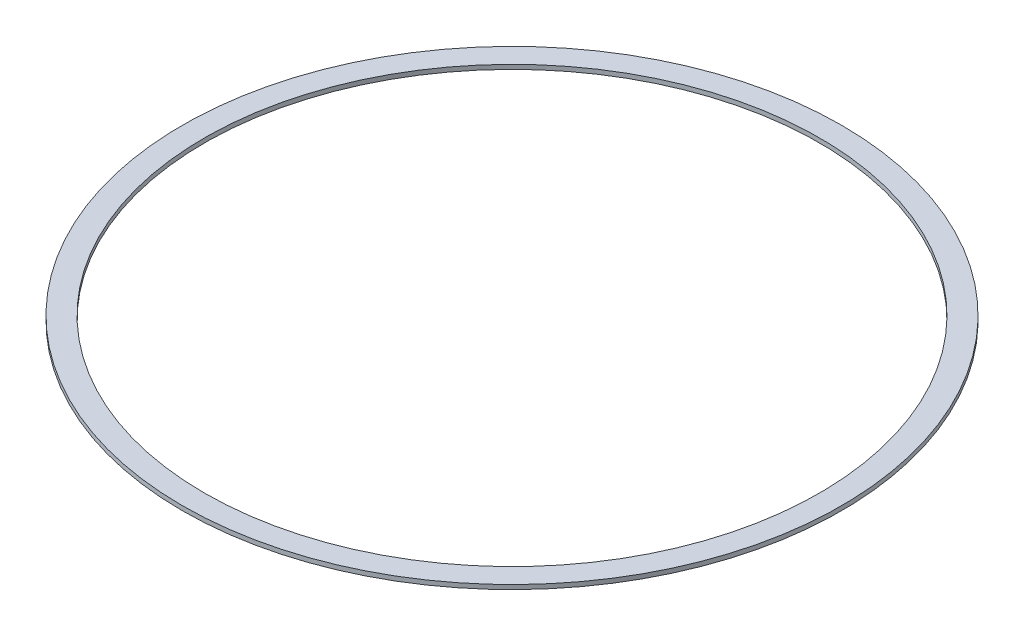
ISO-10303-21;
HEADER;
FILE_DESCRIPTION(('STEP AP214'),'2;1');
FILE_NAME('part.step','',(''),(''),'','','');
FILE_SCHEMA(('AUTOMOTIVE_DESIGN { 1 0 10303 214 1 1 1 1 }'));
ENDSEC;
DATA;
#1=APPLICATION_CONTEXT('core data for automotive mechanical design processes');
#2=APPLICATION_PROTOCOL_DEFINITION('international standard','automotive_design',2000,#1);
#3=PRODUCT_CONTEXT('',#1,'mechanical');
#4=PRODUCT('Part','Part','',(#3));
#5=PRODUCT_RELATED_PRODUCT_CATEGORY('part','',(#4));
#6=PRODUCT_DEFINITION_FORMATION('','',#4);
#7=PRODUCT_DEFINITION_CONTEXT('part definition',#1,'design');
#8=PRODUCT_DEFINITION('design','',#6,#7);
#9=PRODUCT_DEFINITION_SHAPE('','',#8);
#10=(LENGTH_UNIT() NAMED_UNIT(*) SI_UNIT(.MILLI.,.METRE.));
#11=(NAMED_UNIT(*) PLANE_ANGLE_UNIT() SI_UNIT($,.RADIAN.));
#12=(NAMED_UNIT(*) SI_UNIT($,.STERADIAN.) SOLID_ANGLE_UNIT());
#13=UNCERTAINTY_MEASURE_WITH_UNIT(LENGTH_MEASURE(1.E-05),#10,'distance_accuracy_value','');
#14=(GEOMETRIC_REPRESENTATION_CONTEXT(3) GLOBAL_UNCERTAINTY_ASSIGNED_CONTEXT((#13)) GLOBAL_UNIT_ASSIGNED_CONTEXT((#10,
#11,#12)) REPRESENTATION_CONTEXT('',''));
#15=CARTESIAN_POINT('',(0.,0.,0.));
#16=DIRECTION('',(0.,0.,1.));
#17=DIRECTION('',(1.,0.,0.));
#18=AXIS2_PLACEMENT_3D('',#15,#16,#17);
#19=CARTESIAN_POINT('',(0.,1.5,0.));
#20=DIRECTION('',(0.,1.,0.));
#21=DIRECTION('',(0.,0.,1.));
#22=AXIS2_PLACEMENT_3D('',#19,#20,#21);
#23=PLANE('',#22);
#24=CARTESIAN_POINT('',(0.,1.5,0.));
#25=DIRECTION('',(0.,1.,0.));
#26=DIRECTION('',(0.,0.,1.));
#27=AXIS2_PLACEMENT_3D('',#24,#25,#26);
#28=CIRCLE('',#27,225.);
#29=CARTESIAN_POINT('',(0.,1.5,225.));
#30=VERTEX_POINT('',#29);
#31=EDGE_CURVE('E10',#30,#30,#28,.T.);
#32=ORIENTED_EDGE('',*,*,#31,.T.);
#33=EDGE_LOOP('',(#32));
#34=FACE_BOUND('',#33,.T.);
#35=CARTESIAN_POINT('',(0.,1.5,0.));
#36=DIRECTION('',(0.,1.,0.));
#37=DIRECTION('',(0.,0.,1.));
#38=AXIS2_PLACEMENT_3D('',#35,#36,#37);
#39=CIRCLE('',#38,210.);
#40=CARTESIAN_POINT('',(0.,1.5,210.));
#41=VERTEX_POINT('',#40);
#42=EDGE_CURVE('E41',#41,#41,#39,.T.);
#43=ORIENTED_EDGE('',*,*,#42,.F.);
#44=EDGE_LOOP('',(#43));
#45=FACE_BOUND('',#44,.T.);
#46=ADVANCED_FACE('F30',(#34,#45),#23,.T.);
#47=CARTESIAN_POINT('',(0.,-1.5,0.));
#48=DIRECTION('',(0.,1.,0.));
#49=DIRECTION('',(0.,0.,1.));
#50=AXIS2_PLACEMENT_3D('',#47,#48,#49);
#51=PLANE('',#50);
#52=CARTESIAN_POINT('',(0.,-1.5,0.));
#53=DIRECTION('',(0.,1.,0.));
#54=DIRECTION('',(0.,0.,1.));
#55=AXIS2_PLACEMENT_3D('',#52,#53,#54);
#56=CIRCLE('',#55,225.);
#57=CARTESIAN_POINT('',(0.,-1.5,225.));
#58=VERTEX_POINT('',#57);
#59=EDGE_CURVE('E34',#58,#58,#56,.T.);
#60=ORIENTED_EDGE('',*,*,#59,.F.);
#61=EDGE_LOOP('',(#60));
#62=FACE_BOUND('',#61,.T.);
#63=CARTESIAN_POINT('',(0.,-1.5,0.));
#64=DIRECTION('',(0.,1.,0.));
#65=DIRECTION('',(0.,0.,1.));
#66=AXIS2_PLACEMENT_3D('',#63,#64,#65);
#67=CIRCLE('',#66,210.);
#68=CARTESIAN_POINT('',(0.,-1.5,210.));
#69=VERTEX_POINT('',#68);
#70=EDGE_CURVE('E43',#69,#69,#67,.T.);
#71=ORIENTED_EDGE('',*,*,#70,.T.);
#72=EDGE_LOOP('',(#71));
#73=FACE_BOUND('',#72,.T.);
#74=ADVANCED_FACE('F53',(#62,#73),#51,.F.);
#75=CARTESIAN_POINT('',(0.,1.5,0.));
#76=DIRECTION('',(0.,-1.,0.));
#77=DIRECTION('',(0.,0.,-1.));
#78=AXIS2_PLACEMENT_3D('',#75,#76,#77);
#79=CYLINDRICAL_SURFACE('',#78,225.);
#80=ORIENTED_EDGE('',*,*,#31,.F.);
#81=EDGE_LOOP('',(#80));
#82=FACE_BOUND('',#81,.T.);
#83=ORIENTED_EDGE('',*,*,#59,.T.);
#84=EDGE_LOOP('',(#83));
#85=FACE_BOUND('',#84,.T.);
#86=ADVANCED_FACE('F32',(#82,#85),#79,.T.);
#87=CARTESIAN_POINT('',(0.,1.5,0.));
#88=DIRECTION('',(0.,-1.,0.));
#89=DIRECTION('',(0.,0.,-1.));
#90=AXIS2_PLACEMENT_3D('',#87,#88,#89);
#91=CYLINDRICAL_SURFACE('',#90,210.);
#92=ORIENTED_EDGE('',*,*,#42,.T.);
#93=EDGE_LOOP('',(#92));
#94=FACE_BOUND('',#93,.T.);
#95=ORIENTED_EDGE('',*,*,#70,.F.);
#96=EDGE_LOOP('',(#95));
#97=FACE_BOUND('',#96,.T.);
#98=ADVANCED_FACE('F49',(#94,#97),#91,.F.);
#99=CLOSED_SHELL('',(#46,#74,#86,#98));
#100=MANIFOLD_SOLID_BREP('B2',#99);
#101=ADVANCED_BREP_SHAPE_REPRESENTATION('',(#18,#100),#14);
#102=SHAPE_DEFINITION_REPRESENTATION(#9,#101);
ENDSEC;
END-ISO-10303-21;
